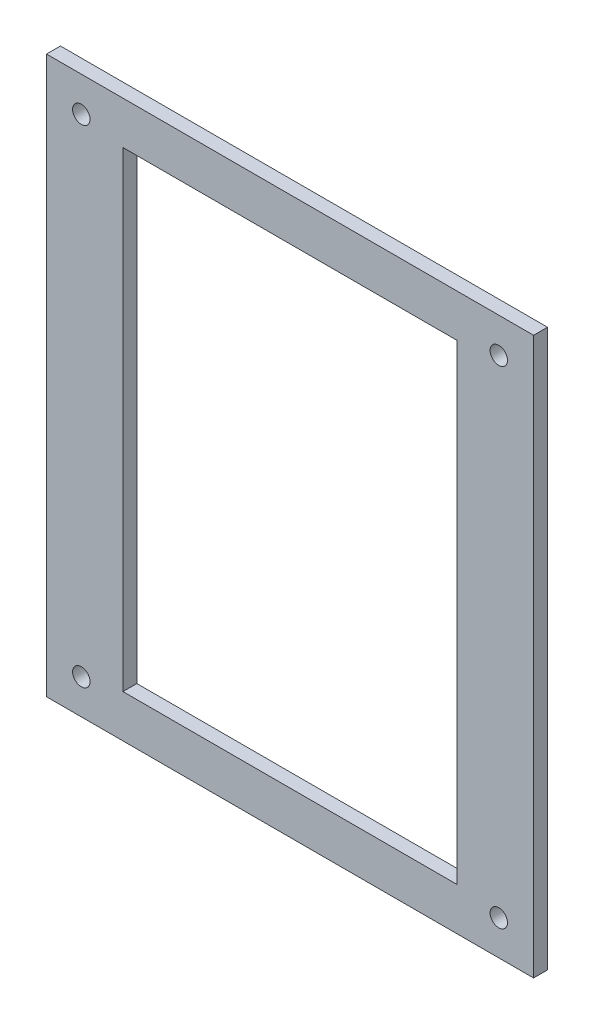
ISO-10303-21;
HEADER;
FILE_DESCRIPTION(('STEP AP214'),'2;1');
FILE_NAME('part.step','',(''),(''),'','','');
FILE_SCHEMA(('AUTOMOTIVE_DESIGN { 1 0 10303 214 1 1 1 1 }'));
ENDSEC;
DATA;
#1=APPLICATION_CONTEXT('core data for automotive mechanical design processes');
#2=APPLICATION_PROTOCOL_DEFINITION('international standard','automotive_design',2000,#1);
#3=PRODUCT_CONTEXT('',#1,'mechanical');
#4=PRODUCT('Part','Part','',(#3));
#5=PRODUCT_RELATED_PRODUCT_CATEGORY('part','',(#4));
#6=PRODUCT_DEFINITION_FORMATION('','',#4);
#7=PRODUCT_DEFINITION_CONTEXT('part definition',#1,'design');
#8=PRODUCT_DEFINITION('design','',#6,#7);
#9=PRODUCT_DEFINITION_SHAPE('','',#8);
#10=(LENGTH_UNIT() NAMED_UNIT(*) SI_UNIT(.MILLI.,.METRE.));
#11=(NAMED_UNIT(*) PLANE_ANGLE_UNIT() SI_UNIT($,.RADIAN.));
#12=(NAMED_UNIT(*) SI_UNIT($,.STERADIAN.) SOLID_ANGLE_UNIT());
#13=UNCERTAINTY_MEASURE_WITH_UNIT(LENGTH_MEASURE(1.E-05),#10,'distance_accuracy_value','');
#14=(GEOMETRIC_REPRESENTATION_CONTEXT(3) GLOBAL_UNCERTAINTY_ASSIGNED_CONTEXT((#13)) GLOBAL_UNIT_ASSIGNED_CONTEXT((#10,
#11,#12)) REPRESENTATION_CONTEXT('',''));
#15=CARTESIAN_POINT('',(0.,0.,0.));
#16=DIRECTION('',(0.,0.,1.));
#17=DIRECTION('',(1.,0.,0.));
#18=AXIS2_PLACEMENT_3D('',#15,#16,#17);
#19=CARTESIAN_POINT('',(0.,0.,2.54));
#20=DIRECTION('',(0.,0.,1.));
#21=DIRECTION('',(1.,0.,0.));
#22=AXIS2_PLACEMENT_3D('',#19,#20,#21);
#23=PLANE('',#22);
#24=CARTESIAN_POINT('',(82.55,-95.25,2.54));
#25=DIRECTION('',(0.,0.,1.));
#26=DIRECTION('',(1.,0.,0.));
#27=AXIS2_PLACEMENT_3D('',#24,#25,#26);
#28=CIRCLE('',#27,1.59);
#29=CARTESIAN_POINT('',(84.14,-95.25,2.54));
#30=VERTEX_POINT('',#29);
#31=EDGE_CURVE('E252',#30,#30,#28,.T.);
#32=ORIENTED_EDGE('',*,*,#31,.F.);
#33=EDGE_LOOP('',(#32));
#34=FACE_BOUND('',#33,.T.);
#35=CARTESIAN_POINT('',(82.55,-6.35,2.54));
#36=DIRECTION('',(0.,0.,1.));
#37=DIRECTION('',(1.,0.,0.));
#38=AXIS2_PLACEMENT_3D('',#35,#36,#37);
#39=CIRCLE('',#38,1.58999999999999);
#40=CARTESIAN_POINT('',(84.14,-6.35,2.54));
#41=VERTEX_POINT('',#40);
#42=EDGE_CURVE('E134',#41,#41,#39,.T.);
#43=ORIENTED_EDGE('',*,*,#42,.F.);
#44=EDGE_LOOP('',(#43));
#45=FACE_BOUND('',#44,.T.);
#46=DIRECTION('',(0.,-1.,0.));
#47=VECTOR('',#46,1.);
#48=CARTESIAN_POINT('',(0.,0.,2.54));
#49=LINE('',#48,#47);
#50=CARTESIAN_POINT('',(0.,0.,2.54));
#51=VERTEX_POINT('',#50);
#52=CARTESIAN_POINT('',(0.,-101.6,2.54));
#53=VERTEX_POINT('',#52);
#54=EDGE_CURVE('E144',#51,#53,#49,.T.);
#55=ORIENTED_EDGE('',*,*,#54,.T.);
#56=DIRECTION('',(1.,0.,0.));
#57=VECTOR('',#56,1.);
#58=CARTESIAN_POINT('',(0.,-101.6,2.54));
#59=LINE('',#58,#57);
#60=CARTESIAN_POINT('',(88.9,-101.6,2.54));
#61=VERTEX_POINT('',#60);
#62=EDGE_CURVE('E147',#53,#61,#59,.T.);
#63=ORIENTED_EDGE('',*,*,#62,.T.);
#64=DIRECTION('',(0.,1.,0.));
#65=VECTOR('',#64,1.);
#66=CARTESIAN_POINT('',(88.9,0.,2.54));
#67=LINE('',#66,#65);
#68=CARTESIAN_POINT('',(88.9,0.,2.54));
#69=VERTEX_POINT('',#68);
#70=EDGE_CURVE('E150',#61,#69,#67,.T.);
#71=ORIENTED_EDGE('',*,*,#70,.T.);
#72=DIRECTION('',(-1.,0.,0.));
#73=VECTOR('',#72,1.);
#74=CARTESIAN_POINT('',(0.,0.,2.54));
#75=LINE('',#74,#73);
#76=EDGE_CURVE('E152',#69,#51,#75,.T.);
#77=ORIENTED_EDGE('',*,*,#76,.T.);
#78=EDGE_LOOP('',(#55,#63,#71,#77));
#79=FACE_BOUND('',#78,.T.);
#80=DIRECTION('',(1.,0.,0.));
#81=VECTOR('',#80,1.);
#82=CARTESIAN_POINT('',(13.95,-93.8,2.54));
#83=LINE('',#82,#81);
#84=CARTESIAN_POINT('',(13.95,-93.8,2.54));
#85=VERTEX_POINT('',#84);
#86=CARTESIAN_POINT('',(74.95,-93.8,2.54));
#87=VERTEX_POINT('',#86);
#88=EDGE_CURVE('E113',#85,#87,#83,.T.);
#89=ORIENTED_EDGE('',*,*,#88,.F.);
#90=DIRECTION('',(0.,-1.,0.));
#91=VECTOR('',#90,1.);
#92=CARTESIAN_POINT('',(13.95,-7.80000000000003,2.54));
#93=LINE('',#92,#91);
#94=CARTESIAN_POINT('',(13.95,-7.80000000000003,2.54));
#95=VERTEX_POINT('',#94);
#96=EDGE_CURVE('E105',#95,#85,#93,.T.);
#97=ORIENTED_EDGE('',*,*,#96,.F.);
#98=DIRECTION('',(-1.,0.,0.));
#99=VECTOR('',#98,1.);
#100=CARTESIAN_POINT('',(13.95,-7.80000000000003,2.54));
#101=LINE('',#100,#99);
#102=CARTESIAN_POINT('',(74.95,-7.80000000000003,2.54));
#103=VERTEX_POINT('',#102);
#104=EDGE_CURVE('E128',#103,#95,#101,.T.);
#105=ORIENTED_EDGE('',*,*,#104,.F.);
#106=DIRECTION('',(0.,1.,0.));
#107=VECTOR('',#106,1.);
#108=CARTESIAN_POINT('',(74.95,-7.80000000000003,2.54));
#109=LINE('',#108,#107);
#110=EDGE_CURVE('E126',#87,#103,#109,.T.);
#111=ORIENTED_EDGE('',*,*,#110,.F.);
#112=EDGE_LOOP('',(#89,#97,#105,#111));
#113=FACE_BOUND('',#112,.T.);
#114=CARTESIAN_POINT('',(6.34999999999999,-95.25,2.54));
#115=DIRECTION('',(0.,0.,1.));
#116=DIRECTION('',(1.,0.,0.));
#117=AXIS2_PLACEMENT_3D('',#114,#115,#116);
#118=CIRCLE('',#117,1.59);
#119=CARTESIAN_POINT('',(7.94,-95.25,2.54));
#120=VERTEX_POINT('',#119);
#121=EDGE_CURVE('E258',#120,#120,#118,.T.);
#122=ORIENTED_EDGE('',*,*,#121,.F.);
#123=EDGE_LOOP('',(#122));
#124=FACE_BOUND('',#123,.T.);
#125=CARTESIAN_POINT('',(6.35,-6.35,2.54));
#126=DIRECTION('',(0.,0.,1.));
#127=DIRECTION('',(1.,0.,0.));
#128=AXIS2_PLACEMENT_3D('',#125,#126,#127);
#129=CIRCLE('',#128,1.59);
#130=CARTESIAN_POINT('',(7.94,-6.35,2.54));
#131=VERTEX_POINT('',#130);
#132=EDGE_CURVE('E243',#131,#131,#129,.T.);
#133=ORIENTED_EDGE('',*,*,#132,.F.);
#134=EDGE_LOOP('',(#133));
#135=FACE_BOUND('',#134,.T.);
#136=ADVANCED_FACE('F40',(#34,#45,#79,#113,#124,#135),#23,.T.);
#137=CARTESIAN_POINT('',(0.,0.,0.));
#138=DIRECTION('',(0.,0.,1.));
#139=DIRECTION('',(1.,0.,0.));
#140=AXIS2_PLACEMENT_3D('',#137,#138,#139);
#141=PLANE('',#140);
#142=DIRECTION('',(0.,-1.,0.));
#143=VECTOR('',#142,1.);
#144=CARTESIAN_POINT('',(0.,0.,0.));
#145=LINE('',#144,#143);
#146=CARTESIAN_POINT('',(0.,0.,0.));
#147=VERTEX_POINT('',#146);
#148=CARTESIAN_POINT('',(0.,-101.6,0.));
#149=VERTEX_POINT('',#148);
#150=EDGE_CURVE('E121',#147,#149,#145,.T.);
#151=ORIENTED_EDGE('',*,*,#150,.F.);
#152=DIRECTION('',(-1.,0.,0.));
#153=VECTOR('',#152,1.);
#154=CARTESIAN_POINT('',(0.,0.,0.));
#155=LINE('',#154,#153);
#156=CARTESIAN_POINT('',(88.9,0.,0.));
#157=VERTEX_POINT('',#156);
#158=EDGE_CURVE('E148',#157,#147,#155,.T.);
#159=ORIENTED_EDGE('',*,*,#158,.F.);
#160=DIRECTION('',(0.,1.,0.));
#161=VECTOR('',#160,1.);
#162=CARTESIAN_POINT('',(88.9,0.,0.));
#163=LINE('',#162,#161);
#164=CARTESIAN_POINT('',(88.9,-101.6,0.));
#165=VERTEX_POINT('',#164);
#166=EDGE_CURVE('E159',#165,#157,#163,.T.);
#167=ORIENTED_EDGE('',*,*,#166,.F.);
#168=DIRECTION('',(1.,0.,0.));
#169=VECTOR('',#168,1.);
#170=CARTESIAN_POINT('',(0.,-101.6,0.));
#171=LINE('',#170,#169);
#172=EDGE_CURVE('E157',#149,#165,#171,.T.);
#173=ORIENTED_EDGE('',*,*,#172,.F.);
#174=EDGE_LOOP('',(#151,#159,#167,#173));
#175=FACE_BOUND('',#174,.T.);
#176=DIRECTION('',(0.,-1.,0.));
#177=VECTOR('',#176,1.);
#178=CARTESIAN_POINT('',(13.95,-7.80000000000003,0.));
#179=LINE('',#178,#177);
#180=CARTESIAN_POINT('',(13.95,-7.80000000000003,0.));
#181=VERTEX_POINT('',#180);
#182=CARTESIAN_POINT('',(13.95,-93.8,0.));
#183=VERTEX_POINT('',#182);
#184=EDGE_CURVE('E63',#181,#183,#179,.T.);
#185=ORIENTED_EDGE('',*,*,#184,.T.);
#186=DIRECTION('',(1.,0.,0.));
#187=VECTOR('',#186,1.);
#188=CARTESIAN_POINT('',(13.95,-93.8,0.));
#189=LINE('',#188,#187);
#190=CARTESIAN_POINT('',(74.95,-93.8,0.));
#191=VERTEX_POINT('',#190);
#192=EDGE_CURVE('E120',#183,#191,#189,.T.);
#193=ORIENTED_EDGE('',*,*,#192,.T.);
#194=DIRECTION('',(0.,1.,0.));
#195=VECTOR('',#194,1.);
#196=CARTESIAN_POINT('',(74.95,-7.80000000000003,0.));
#197=LINE('',#196,#195);
#198=CARTESIAN_POINT('',(74.95,-7.80000000000003,0.));
#199=VERTEX_POINT('',#198);
#200=EDGE_CURVE('E136',#191,#199,#197,.T.);
#201=ORIENTED_EDGE('',*,*,#200,.T.);
#202=DIRECTION('',(-1.,0.,0.));
#203=VECTOR('',#202,1.);
#204=CARTESIAN_POINT('',(13.95,-7.80000000000003,0.));
#205=LINE('',#204,#203);
#206=EDGE_CURVE('E114',#199,#181,#205,.T.);
#207=ORIENTED_EDGE('',*,*,#206,.T.);
#208=EDGE_LOOP('',(#185,#193,#201,#207));
#209=FACE_BOUND('',#208,.T.);
#210=CARTESIAN_POINT('',(82.55,-6.35,0.));
#211=DIRECTION('',(0.,0.,1.));
#212=DIRECTION('',(1.,0.,0.));
#213=AXIS2_PLACEMENT_3D('',#210,#211,#212);
#214=CIRCLE('',#213,1.58999999999999);
#215=CARTESIAN_POINT('',(84.14,-6.35,0.));
#216=VERTEX_POINT('',#215);
#217=EDGE_CURVE('E261',#216,#216,#214,.T.);
#218=ORIENTED_EDGE('',*,*,#217,.T.);
#219=EDGE_LOOP('',(#218));
#220=FACE_BOUND('',#219,.T.);
#221=CARTESIAN_POINT('',(6.34999999999999,-95.25,0.));
#222=DIRECTION('',(0.,0.,1.));
#223=DIRECTION('',(1.,0.,0.));
#224=AXIS2_PLACEMENT_3D('',#221,#222,#223);
#225=CIRCLE('',#224,1.59);
#226=CARTESIAN_POINT('',(7.94,-95.25,0.));
#227=VERTEX_POINT('',#226);
#228=EDGE_CURVE('E255',#227,#227,#225,.T.);
#229=ORIENTED_EDGE('',*,*,#228,.T.);
#230=EDGE_LOOP('',(#229));
#231=FACE_BOUND('',#230,.T.);
#232=CARTESIAN_POINT('',(82.55,-95.25,0.));
#233=DIRECTION('',(0.,0.,1.));
#234=DIRECTION('',(1.,0.,0.));
#235=AXIS2_PLACEMENT_3D('',#232,#233,#234);
#236=CIRCLE('',#235,1.59);
#237=CARTESIAN_POINT('',(84.14,-95.25,0.));
#238=VERTEX_POINT('',#237);
#239=EDGE_CURVE('E249',#238,#238,#236,.T.);
#240=ORIENTED_EDGE('',*,*,#239,.T.);
#241=EDGE_LOOP('',(#240));
#242=FACE_BOUND('',#241,.T.);
#243=CARTESIAN_POINT('',(6.35,-6.35,0.));
#244=DIRECTION('',(0.,0.,1.));
#245=DIRECTION('',(1.,0.,0.));
#246=AXIS2_PLACEMENT_3D('',#243,#244,#245);
#247=CIRCLE('',#246,1.59);
#248=CARTESIAN_POINT('',(7.94,-6.35,0.));
#249=VERTEX_POINT('',#248);
#250=EDGE_CURVE('E246',#249,#249,#247,.T.);
#251=ORIENTED_EDGE('',*,*,#250,.T.);
#252=EDGE_LOOP('',(#251));
#253=FACE_BOUND('',#252,.T.);
#254=ADVANCED_FACE('F177',(#175,#209,#220,#231,#242,#253),#141,.F.);
#255=CARTESIAN_POINT('',(0.,0.,2.54));
#256=DIRECTION('',(1.,0.,0.));
#257=DIRECTION('',(0.,0.,-1.));
#258=AXIS2_PLACEMENT_3D('',#255,#256,#257);
#259=PLANE('',#258);
#260=ORIENTED_EDGE('',*,*,#150,.T.);
#261=DIRECTION('',(0.,0.,-1.));
#262=VECTOR('',#261,1.);
#263=CARTESIAN_POINT('',(0.,-101.6,2.54));
#264=LINE('',#263,#262);
#265=EDGE_CURVE('E11',#53,#149,#264,.T.);
#266=ORIENTED_EDGE('',*,*,#265,.F.);
#267=ORIENTED_EDGE('',*,*,#54,.F.);
#268=DIRECTION('',(0.,0.,-1.));
#269=VECTOR('',#268,1.);
#270=CARTESIAN_POINT('',(0.,0.,2.54));
#271=LINE('',#270,#269);
#272=EDGE_CURVE('E154',#51,#147,#271,.T.);
#273=ORIENTED_EDGE('',*,*,#272,.T.);
#274=EDGE_LOOP('',(#260,#266,#267,#273));
#275=FACE_BOUND('',#274,.T.);
#276=ADVANCED_FACE('F42',(#275),#259,.F.);
#277=CARTESIAN_POINT('',(0.,-101.6,2.54));
#278=DIRECTION('',(0.,1.,0.));
#279=DIRECTION('',(-1.,0.,0.));
#280=AXIS2_PLACEMENT_3D('',#277,#278,#279);
#281=PLANE('',#280);
#282=ORIENTED_EDGE('',*,*,#172,.T.);
#283=DIRECTION('',(0.,0.,-1.));
#284=VECTOR('',#283,1.);
#285=CARTESIAN_POINT('',(88.9,-101.6,2.54));
#286=LINE('',#285,#284);
#287=EDGE_CURVE('E48',#61,#165,#286,.T.);
#288=ORIENTED_EDGE('',*,*,#287,.F.);
#289=ORIENTED_EDGE('',*,*,#62,.F.);
#290=ORIENTED_EDGE('',*,*,#265,.T.);
#291=EDGE_LOOP('',(#282,#288,#289,#290));
#292=FACE_BOUND('',#291,.T.);
#293=ADVANCED_FACE('F187',(#292),#281,.F.);
#294=CARTESIAN_POINT('',(88.9,0.,2.54));
#295=DIRECTION('',(-1.,0.,0.));
#296=DIRECTION('',(0.,0.,1.));
#297=AXIS2_PLACEMENT_3D('',#294,#295,#296);
#298=PLANE('',#297);
#299=ORIENTED_EDGE('',*,*,#166,.T.);
#300=DIRECTION('',(0.,0.,-1.));
#301=VECTOR('',#300,1.);
#302=CARTESIAN_POINT('',(88.9,0.,2.54));
#303=LINE('',#302,#301);
#304=EDGE_CURVE('E164',#69,#157,#303,.T.);
#305=ORIENTED_EDGE('',*,*,#304,.F.);
#306=ORIENTED_EDGE('',*,*,#70,.F.);
#307=ORIENTED_EDGE('',*,*,#287,.T.);
#308=EDGE_LOOP('',(#299,#305,#306,#307));
#309=FACE_BOUND('',#308,.T.);
#310=ADVANCED_FACE('F171',(#309),#298,.F.);
#311=CARTESIAN_POINT('',(0.,0.,2.54));
#312=DIRECTION('',(0.,-1.,0.));
#313=DIRECTION('',(0.,0.,-1.));
#314=AXIS2_PLACEMENT_3D('',#311,#312,#313);
#315=PLANE('',#314);
#316=ORIENTED_EDGE('',*,*,#158,.T.);
#317=ORIENTED_EDGE('',*,*,#272,.F.);
#318=ORIENTED_EDGE('',*,*,#76,.F.);
#319=ORIENTED_EDGE('',*,*,#304,.T.);
#320=EDGE_LOOP('',(#316,#317,#318,#319));
#321=FACE_BOUND('',#320,.T.);
#322=ADVANCED_FACE('F181',(#321),#315,.F.);
#323=CARTESIAN_POINT('',(13.95,-7.80000000000003,2.54));
#324=DIRECTION('',(1.,0.,0.));
#325=DIRECTION('',(0.,1.,0.));
#326=AXIS2_PLACEMENT_3D('',#323,#324,#325);
#327=PLANE('',#326);
#328=ORIENTED_EDGE('',*,*,#184,.F.);
#329=DIRECTION('',(0.,0.,-1.));
#330=VECTOR('',#329,1.);
#331=CARTESIAN_POINT('',(13.95,-7.80000000000003,2.54));
#332=LINE('',#331,#330);
#333=EDGE_CURVE('E109',#95,#181,#332,.T.);
#334=ORIENTED_EDGE('',*,*,#333,.F.);
#335=ORIENTED_EDGE('',*,*,#96,.T.);
#336=DIRECTION('',(0.,0.,-1.));
#337=VECTOR('',#336,1.);
#338=CARTESIAN_POINT('',(13.95,-93.8,2.54));
#339=LINE('',#338,#337);
#340=EDGE_CURVE('E108',#85,#183,#339,.T.);
#341=ORIENTED_EDGE('',*,*,#340,.T.);
#342=EDGE_LOOP('',(#328,#334,#335,#341));
#343=FACE_BOUND('',#342,.T.);
#344=ADVANCED_FACE('F107',(#343),#327,.T.);
#345=CARTESIAN_POINT('',(13.95,-93.8,2.54));
#346=DIRECTION('',(0.,1.,0.));
#347=DIRECTION('',(-1.,0.,0.));
#348=AXIS2_PLACEMENT_3D('',#345,#346,#347);
#349=PLANE('',#348);
#350=ORIENTED_EDGE('',*,*,#192,.F.);
#351=ORIENTED_EDGE('',*,*,#340,.F.);
#352=ORIENTED_EDGE('',*,*,#88,.T.);
#353=DIRECTION('',(0.,0.,-1.));
#354=VECTOR('',#353,1.);
#355=CARTESIAN_POINT('',(74.95,-93.8,2.54));
#356=LINE('',#355,#354);
#357=EDGE_CURVE('E122',#87,#191,#356,.T.);
#358=ORIENTED_EDGE('',*,*,#357,.T.);
#359=EDGE_LOOP('',(#350,#351,#352,#358));
#360=FACE_BOUND('',#359,.T.);
#361=ADVANCED_FACE('F117',(#360),#349,.T.);
#362=CARTESIAN_POINT('',(74.95,-7.80000000000003,2.54));
#363=DIRECTION('',(-1.,0.,0.));
#364=DIRECTION('',(0.,-1.,0.));
#365=AXIS2_PLACEMENT_3D('',#362,#363,#364);
#366=PLANE('',#365);
#367=ORIENTED_EDGE('',*,*,#200,.F.);
#368=ORIENTED_EDGE('',*,*,#357,.F.);
#369=ORIENTED_EDGE('',*,*,#110,.T.);
#370=DIRECTION('',(0.,0.,-1.));
#371=VECTOR('',#370,1.);
#372=CARTESIAN_POINT('',(74.95,-7.80000000000003,2.54));
#373=LINE('',#372,#371);
#374=EDGE_CURVE('E55',#103,#199,#373,.T.);
#375=ORIENTED_EDGE('',*,*,#374,.T.);
#376=EDGE_LOOP('',(#367,#368,#369,#375));
#377=FACE_BOUND('',#376,.T.);
#378=ADVANCED_FACE('F213',(#377),#366,.T.);
#379=CARTESIAN_POINT('',(13.95,-7.80000000000003,2.54));
#380=DIRECTION('',(0.,-1.,0.));
#381=DIRECTION('',(1.,0.,0.));
#382=AXIS2_PLACEMENT_3D('',#379,#380,#381);
#383=PLANE('',#382);
#384=ORIENTED_EDGE('',*,*,#206,.F.);
#385=ORIENTED_EDGE('',*,*,#374,.F.);
#386=ORIENTED_EDGE('',*,*,#104,.T.);
#387=ORIENTED_EDGE('',*,*,#333,.T.);
#388=EDGE_LOOP('',(#384,#385,#386,#387));
#389=FACE_BOUND('',#388,.T.);
#390=ADVANCED_FACE('F217',(#389),#383,.T.);
#391=CARTESIAN_POINT('',(82.55,-6.35,2.54));
#392=DIRECTION('',(0.,0.,-1.));
#393=DIRECTION('',(-1.,0.,0.));
#394=AXIS2_PLACEMENT_3D('',#391,#392,#393);
#395=CYLINDRICAL_SURFACE('',#394,1.58999999999999);
#396=ORIENTED_EDGE('',*,*,#42,.T.);
#397=EDGE_LOOP('',(#396));
#398=FACE_BOUND('',#397,.T.);
#399=ORIENTED_EDGE('',*,*,#217,.F.);
#400=EDGE_LOOP('',(#399));
#401=FACE_BOUND('',#400,.T.);
#402=ADVANCED_FACE('F223',(#398,#401),#395,.F.);
#403=CARTESIAN_POINT('',(6.34999999999999,-95.25,2.54));
#404=DIRECTION('',(0.,0.,-1.));
#405=DIRECTION('',(-1.,0.,0.));
#406=AXIS2_PLACEMENT_3D('',#403,#404,#405);
#407=CYLINDRICAL_SURFACE('',#406,1.59);
#408=ORIENTED_EDGE('',*,*,#121,.T.);
#409=EDGE_LOOP('',(#408));
#410=FACE_BOUND('',#409,.T.);
#411=ORIENTED_EDGE('',*,*,#228,.F.);
#412=EDGE_LOOP('',(#411));
#413=FACE_BOUND('',#412,.T.);
#414=ADVANCED_FACE('F226',(#410,#413),#407,.F.);
#415=CARTESIAN_POINT('',(82.55,-95.25,2.54));
#416=DIRECTION('',(0.,0.,-1.));
#417=DIRECTION('',(-1.,0.,0.));
#418=AXIS2_PLACEMENT_3D('',#415,#416,#417);
#419=CYLINDRICAL_SURFACE('',#418,1.59);
#420=ORIENTED_EDGE('',*,*,#31,.T.);
#421=EDGE_LOOP('',(#420));
#422=FACE_BOUND('',#421,.T.);
#423=ORIENTED_EDGE('',*,*,#239,.F.);
#424=EDGE_LOOP('',(#423));
#425=FACE_BOUND('',#424,.T.);
#426=ADVANCED_FACE('F230',(#422,#425),#419,.F.);
#427=CARTESIAN_POINT('',(6.35,-6.35,2.54));
#428=DIRECTION('',(0.,0.,-1.));
#429=DIRECTION('',(-1.,0.,0.));
#430=AXIS2_PLACEMENT_3D('',#427,#428,#429);
#431=CYLINDRICAL_SURFACE('',#430,1.59);
#432=ORIENTED_EDGE('',*,*,#132,.T.);
#433=EDGE_LOOP('',(#432));
#434=FACE_BOUND('',#433,.T.);
#435=ORIENTED_EDGE('',*,*,#250,.F.);
#436=EDGE_LOOP('',(#435));
#437=FACE_BOUND('',#436,.T.);
#438=ADVANCED_FACE('F234',(#434,#437),#431,.F.);
#439=CLOSED_SHELL('',(#136,#254,#276,#293,#310,#322,#344,#361,#378,#390,#402,#414,#426,#438));
#440=MANIFOLD_SOLID_BREP('B2',#439);
#441=ADVANCED_BREP_SHAPE_REPRESENTATION('',(#18,#440),#14);
#442=SHAPE_DEFINITION_REPRESENTATION(#9,#441);
ENDSEC;
END-ISO-10303-21;
